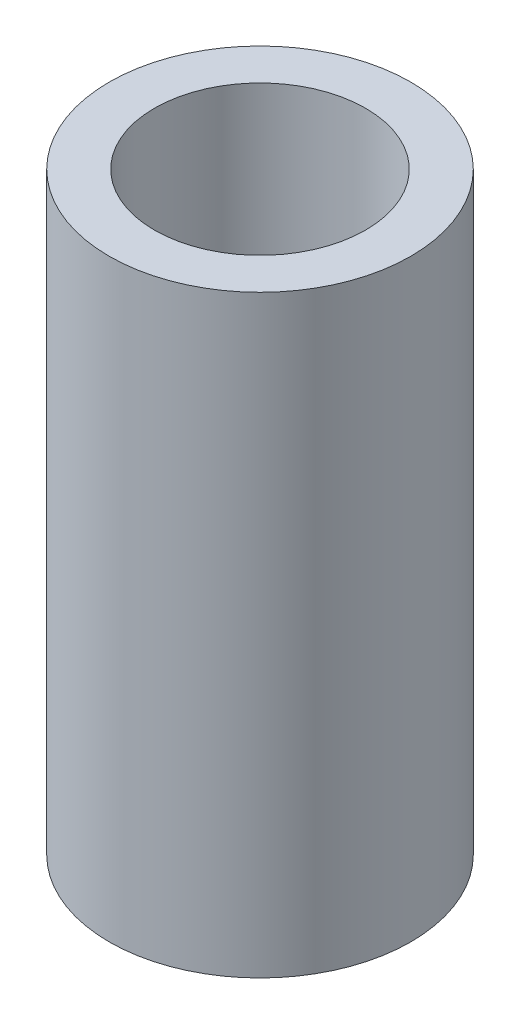
ISO-10303-21;
HEADER;
FILE_DESCRIPTION(('STEP AP214'),'2;1');
FILE_NAME('part.step','',(''),(''),'','','');
FILE_SCHEMA(('AUTOMOTIVE_DESIGN { 1 0 10303 214 1 1 1 1 }'));
ENDSEC;
DATA;
#1=APPLICATION_CONTEXT('core data for automotive mechanical design processes');
#2=APPLICATION_PROTOCOL_DEFINITION('international standard','automotive_design',2000,#1);
#3=PRODUCT_CONTEXT('',#1,'mechanical');
#4=PRODUCT('Part','Part','',(#3));
#5=PRODUCT_RELATED_PRODUCT_CATEGORY('part','',(#4));
#6=PRODUCT_DEFINITION_FORMATION('','',#4);
#7=PRODUCT_DEFINITION_CONTEXT('part definition',#1,'design');
#8=PRODUCT_DEFINITION('design','',#6,#7);
#9=PRODUCT_DEFINITION_SHAPE('','',#8);
#10=(LENGTH_UNIT() NAMED_UNIT(*) SI_UNIT(.MILLI.,.METRE.));
#11=(NAMED_UNIT(*) PLANE_ANGLE_UNIT() SI_UNIT($,.RADIAN.));
#12=(NAMED_UNIT(*) SI_UNIT($,.STERADIAN.) SOLID_ANGLE_UNIT());
#13=UNCERTAINTY_MEASURE_WITH_UNIT(LENGTH_MEASURE(1.E-05),#10,'distance_accuracy_value','');
#14=(GEOMETRIC_REPRESENTATION_CONTEXT(3) GLOBAL_UNCERTAINTY_ASSIGNED_CONTEXT((#13)) GLOBAL_UNIT_ASSIGNED_CONTEXT((#10,
#11,#12)) REPRESENTATION_CONTEXT('',''));
#15=CARTESIAN_POINT('',(0.,0.,0.));
#16=DIRECTION('',(0.,0.,1.));
#17=DIRECTION('',(1.,0.,0.));
#18=AXIS2_PLACEMENT_3D('',#15,#16,#17);
#19=CARTESIAN_POINT('',(0.,10.,0.));
#20=DIRECTION('',(0.,-1.,0.));
#21=DIRECTION('',(0.,0.,-1.));
#22=AXIS2_PLACEMENT_3D('',#19,#20,#21);
#23=CYLINDRICAL_SURFACE('',#22,2.54);
#24=CARTESIAN_POINT('',(0.,10.,0.));
#25=DIRECTION('',(0.,1.,0.));
#26=DIRECTION('',(0.,0.,1.));
#27=AXIS2_PLACEMENT_3D('',#24,#25,#26);
#28=CIRCLE('',#27,2.54);
#29=CARTESIAN_POINT('',(0.,10.,2.54));
#30=VERTEX_POINT('',#29);
#31=EDGE_CURVE('E10',#30,#30,#28,.T.);
#32=ORIENTED_EDGE('',*,*,#31,.F.);
#33=EDGE_LOOP('',(#32));
#34=FACE_BOUND('',#33,.T.);
#35=CARTESIAN_POINT('',(0.,0.,0.));
#36=DIRECTION('',(0.,1.,0.));
#37=DIRECTION('',(0.,0.,1.));
#38=AXIS2_PLACEMENT_3D('',#35,#36,#37);
#39=CIRCLE('',#38,2.54);
#40=CARTESIAN_POINT('',(0.,0.,2.54));
#41=VERTEX_POINT('',#40);
#42=EDGE_CURVE('E34',#41,#41,#39,.T.);
#43=ORIENTED_EDGE('',*,*,#42,.T.);
#44=EDGE_LOOP('',(#43));
#45=FACE_BOUND('',#44,.T.);
#46=ADVANCED_FACE('F31',(#34,#45),#23,.T.);
#47=CARTESIAN_POINT('',(0.,10.,0.));
#48=DIRECTION('',(0.,1.,0.));
#49=DIRECTION('',(0.,0.,1.));
#50=AXIS2_PLACEMENT_3D('',#47,#48,#49);
#51=PLANE('',#50);
#52=CARTESIAN_POINT('',(0.,10.,0.));
#53=DIRECTION('',(0.,1.,0.));
#54=DIRECTION('',(0.,0.,1.));
#55=AXIS2_PLACEMENT_3D('',#52,#53,#54);
#56=CIRCLE('',#55,1.778);
#57=CARTESIAN_POINT('',(0.,10.,1.778));
#58=VERTEX_POINT('',#57);
#59=EDGE_CURVE('E43',#58,#58,#56,.T.);
#60=ORIENTED_EDGE('',*,*,#59,.F.);
#61=EDGE_LOOP('',(#60));
#62=FACE_BOUND('',#61,.T.);
#63=ORIENTED_EDGE('',*,*,#31,.T.);
#64=EDGE_LOOP('',(#63));
#65=FACE_BOUND('',#64,.T.);
#66=ADVANCED_FACE('F58',(#62,#65),#51,.T.);
#67=CARTESIAN_POINT('',(0.,0.,0.));
#68=DIRECTION('',(0.,1.,0.));
#69=DIRECTION('',(0.,0.,1.));
#70=AXIS2_PLACEMENT_3D('',#67,#68,#69);
#71=PLANE('',#70);
#72=CARTESIAN_POINT('',(0.,0.,0.));
#73=DIRECTION('',(0.,1.,0.));
#74=DIRECTION('',(0.,0.,1.));
#75=AXIS2_PLACEMENT_3D('',#72,#73,#74);
#76=CIRCLE('',#75,1.778);
#77=CARTESIAN_POINT('',(0.,0.,1.778));
#78=VERTEX_POINT('',#77);
#79=EDGE_CURVE('E41',#78,#78,#76,.T.);
#80=ORIENTED_EDGE('',*,*,#79,.T.);
#81=EDGE_LOOP('',(#80));
#82=FACE_BOUND('',#81,.T.);
#83=ORIENTED_EDGE('',*,*,#42,.F.);
#84=EDGE_LOOP('',(#83));
#85=FACE_BOUND('',#84,.T.);
#86=ADVANCED_FACE('F49',(#82,#85),#71,.F.);
#87=CARTESIAN_POINT('',(0.,0.,0.));
#88=DIRECTION('',(0.,1.,0.));
#89=DIRECTION('',(0.,0.,1.));
#90=AXIS2_PLACEMENT_3D('',#87,#88,#89);
#91=CYLINDRICAL_SURFACE('',#90,1.778);
#92=ORIENTED_EDGE('',*,*,#79,.F.);
#93=EDGE_LOOP('',(#92));
#94=FACE_BOUND('',#93,.T.);
#95=ORIENTED_EDGE('',*,*,#59,.T.);
#96=EDGE_LOOP('',(#95));
#97=FACE_BOUND('',#96,.T.);
#98=ADVANCED_FACE('F52',(#94,#97),#91,.F.);
#99=CLOSED_SHELL('',(#46,#66,#86,#98));
#100=MANIFOLD_SOLID_BREP('B2',#99);
#101=ADVANCED_BREP_SHAPE_REPRESENTATION('',(#18,#100),#14);
#102=SHAPE_DEFINITION_REPRESENTATION(#9,#101);
ENDSEC;
END-ISO-10303-21;
